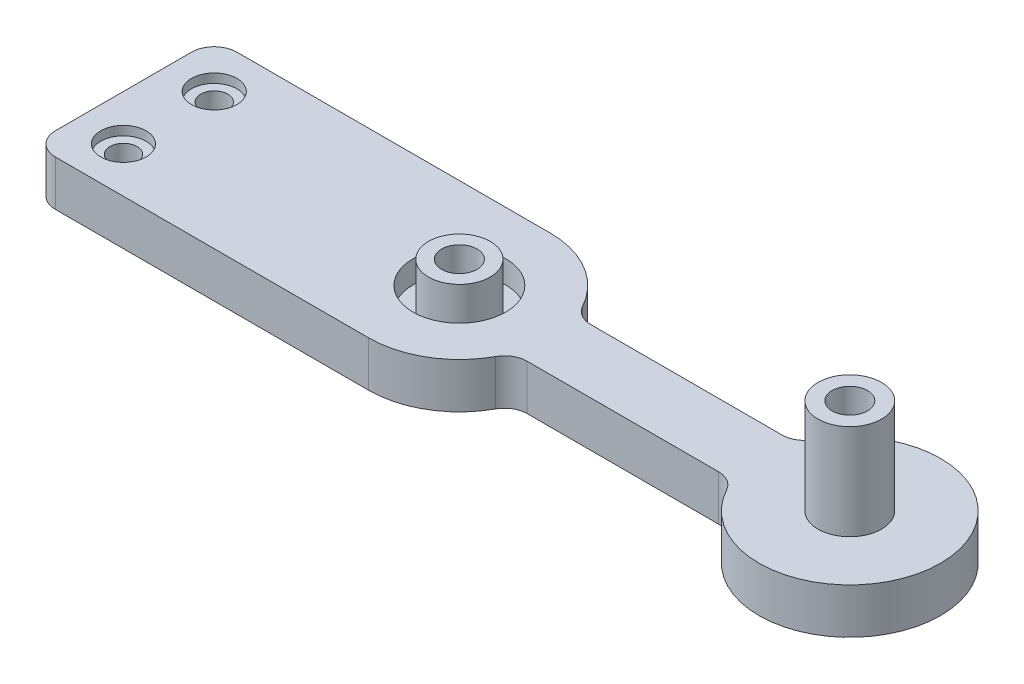
ISO-10303-21;
HEADER;
FILE_DESCRIPTION(('STEP AP214'),'2;1');
FILE_NAME('part.step','',(''),(''),'','','');
FILE_SCHEMA(('AUTOMOTIVE_DESIGN { 1 0 10303 214 1 1 1 1 }'));
ENDSEC;
DATA;
#1=APPLICATION_CONTEXT('core data for automotive mechanical design processes');
#2=APPLICATION_PROTOCOL_DEFINITION('international standard','automotive_design',2000,#1);
#3=PRODUCT_CONTEXT('',#1,'mechanical');
#4=PRODUCT('Part','Part','',(#3));
#5=PRODUCT_RELATED_PRODUCT_CATEGORY('part','',(#4));
#6=PRODUCT_DEFINITION_FORMATION('','',#4);
#7=PRODUCT_DEFINITION_CONTEXT('part definition',#1,'design');
#8=PRODUCT_DEFINITION('design','',#6,#7);
#9=PRODUCT_DEFINITION_SHAPE('','',#8);
#10=(LENGTH_UNIT() NAMED_UNIT(*) SI_UNIT(.MILLI.,.METRE.));
#11=(NAMED_UNIT(*) PLANE_ANGLE_UNIT() SI_UNIT($,.RADIAN.));
#12=(NAMED_UNIT(*) SI_UNIT($,.STERADIAN.) SOLID_ANGLE_UNIT());
#13=UNCERTAINTY_MEASURE_WITH_UNIT(LENGTH_MEASURE(1.E-05),#10,'distance_accuracy_value','');
#14=(GEOMETRIC_REPRESENTATION_CONTEXT(3) GLOBAL_UNCERTAINTY_ASSIGNED_CONTEXT((#13)) GLOBAL_UNIT_ASSIGNED_CONTEXT((#10,
#11,#12)) REPRESENTATION_CONTEXT('',''));
#15=CARTESIAN_POINT('',(0.,0.,0.));
#16=DIRECTION('',(0.,0.,1.));
#17=DIRECTION('',(1.,0.,0.));
#18=AXIS2_PLACEMENT_3D('',#15,#16,#17);
#19=CARTESIAN_POINT('',(-43.815,6.35,9.52500000000001));
#20=DIRECTION('',(0.,1.,0.));
#21=DIRECTION('',(0.,0.,1.));
#22=AXIS2_PLACEMENT_3D('',#19,#20,#21);
#23=PLANE('',#22);
#24=CARTESIAN_POINT('',(-40.64,6.35,-6.35));
#25=DIRECTION('',(0.,1.,0.));
#26=DIRECTION('',(0.,0.,1.));
#27=AXIS2_PLACEMENT_3D('',#24,#25,#26);
#28=CIRCLE('',#27,3.175);
#29=CARTESIAN_POINT('',(-40.64,6.35,-3.175));
#30=VERTEX_POINT('',#29);
#31=EDGE_CURVE('E346',#30,#30,#28,.T.);
#32=ORIENTED_EDGE('',*,*,#31,.F.);
#33=EDGE_LOOP('',(#32));
#34=FACE_BOUND('',#33,.T.);
#35=CARTESIAN_POINT('',(-40.64,6.35,6.35));
#36=DIRECTION('',(0.,1.,0.));
#37=DIRECTION('',(0.,0.,1.));
#38=AXIS2_PLACEMENT_3D('',#35,#36,#37);
#39=CIRCLE('',#38,3.175);
#40=CARTESIAN_POINT('',(-40.64,6.35,9.525));
#41=VERTEX_POINT('',#40);
#42=EDGE_CURVE('E349',#41,#41,#39,.T.);
#43=ORIENTED_EDGE('',*,*,#42,.F.);
#44=EDGE_LOOP('',(#43));
#45=FACE_BOUND('',#44,.T.);
#46=CARTESIAN_POINT('',(-43.815,6.35,9.52500000000001));
#47=DIRECTION('',(0.,1.,0.));
#48=DIRECTION('',(0.,0.,1.));
#49=AXIS2_PLACEMENT_3D('',#46,#47,#48);
#50=CIRCLE('',#49,3.175);
#51=CARTESIAN_POINT('',(-46.99,6.35,9.52499999999999));
#52=VERTEX_POINT('',#51);
#53=CARTESIAN_POINT('',(-43.815,6.35,12.7));
#54=VERTEX_POINT('',#53);
#55=EDGE_CURVE('E207',#52,#54,#50,.T.);
#56=ORIENTED_EDGE('',*,*,#55,.T.);
#57=DIRECTION('',(1.,0.,0.));
#58=VECTOR('',#57,1.);
#59=CARTESIAN_POINT('',(-43.815,6.35,12.7));
#60=LINE('',#59,#58);
#61=CARTESIAN_POINT('',(0.,6.35,12.7));
#62=VERTEX_POINT('',#61);
#63=EDGE_CURVE('E125',#54,#62,#60,.T.);
#64=ORIENTED_EDGE('',*,*,#63,.T.);
#65=CARTESIAN_POINT('',(0.,6.35,0.));
#66=DIRECTION('',(0.,1.,0.));
#67=DIRECTION('',(0.,0.,1.));
#68=AXIS2_PLACEMENT_3D('',#65,#66,#67);
#69=CIRCLE('',#68,12.7);
#70=CARTESIAN_POINT('',(11.1413097973263,6.35,6.096));
#71=VERTEX_POINT('',#70);
#72=EDGE_CURVE('E240',#62,#71,#69,.T.);
#73=ORIENTED_EDGE('',*,*,#72,.T.);
#74=CARTESIAN_POINT('',(13.9266372466579,6.35,7.62));
#75=DIRECTION('',(0.,-1.,0.));
#76=DIRECTION('',(0.,0.,1.));
#77=AXIS2_PLACEMENT_3D('',#74,#75,#76);
#78=CIRCLE('',#77,3.175);
#79=CARTESIAN_POINT('',(13.9266372466579,6.35,4.445));
#80=VERTEX_POINT('',#79);
#81=EDGE_CURVE('E259',#71,#80,#78,.T.);
#82=ORIENTED_EDGE('',*,*,#81,.T.);
#83=DIRECTION('',(1.,0.,0.));
#84=VECTOR('',#83,1.);
#85=CARTESIAN_POINT('',(13.9266372466579,6.35,4.445));
#86=LINE('',#85,#84);
#87=CARTESIAN_POINT('',(40.6833627533421,6.35,4.445));
#88=VERTEX_POINT('',#87);
#89=EDGE_CURVE('E256',#80,#88,#86,.T.);
#90=ORIENTED_EDGE('',*,*,#89,.T.);
#91=CARTESIAN_POINT('',(40.6833627533421,6.35,7.62));
#92=DIRECTION('',(0.,-1.,0.));
#93=DIRECTION('',(0.,0.,-1.));
#94=AXIS2_PLACEMENT_3D('',#91,#92,#93);
#95=CIRCLE('',#94,3.175);
#96=CARTESIAN_POINT('',(43.4686902026736,6.35,6.09599999999999));
#97=VERTEX_POINT('',#96);
#98=EDGE_CURVE('E258',#88,#97,#95,.T.);
#99=ORIENTED_EDGE('',*,*,#98,.T.);
#100=CARTESIAN_POINT('',(54.61,6.35,0.));
#101=DIRECTION('',(0.,1.,0.));
#102=DIRECTION('',(0.,0.,1.));
#103=AXIS2_PLACEMENT_3D('',#100,#101,#102);
#104=CIRCLE('',#103,12.7);
#105=CARTESIAN_POINT('',(43.4686902026737,6.35,-6.096));
#106=VERTEX_POINT('',#105);
#107=EDGE_CURVE('E261',#97,#106,#104,.T.);
#108=ORIENTED_EDGE('',*,*,#107,.T.);
#109=CARTESIAN_POINT('',(40.6833627533421,6.35,-7.62));
#110=DIRECTION('',(0.,-1.,0.));
#111=DIRECTION('',(0.,0.,1.));
#112=AXIS2_PLACEMENT_3D('',#109,#110,#111);
#113=CIRCLE('',#112,3.175);
#114=CARTESIAN_POINT('',(40.6833627533421,6.35,-4.445));
#115=VERTEX_POINT('',#114);
#116=EDGE_CURVE('E267',#106,#115,#113,.T.);
#117=ORIENTED_EDGE('',*,*,#116,.T.);
#118=DIRECTION('',(-1.,0.,0.));
#119=VECTOR('',#118,1.);
#120=CARTESIAN_POINT('',(13.9266372466579,6.35,-4.445));
#121=LINE('',#120,#119);
#122=CARTESIAN_POINT('',(13.9266372466579,6.35,-4.445));
#123=VERTEX_POINT('',#122);
#124=EDGE_CURVE('E269',#115,#123,#121,.T.);
#125=ORIENTED_EDGE('',*,*,#124,.T.);
#126=CARTESIAN_POINT('',(13.9266372466579,6.35,-7.62));
#127=DIRECTION('',(0.,-1.,0.));
#128=DIRECTION('',(0.,0.,-1.));
#129=AXIS2_PLACEMENT_3D('',#126,#127,#128);
#130=CIRCLE('',#129,3.175);
#131=CARTESIAN_POINT('',(11.1413097973263,6.35,-6.096));
#132=VERTEX_POINT('',#131);
#133=EDGE_CURVE('E271',#123,#132,#130,.T.);
#134=ORIENTED_EDGE('',*,*,#133,.T.);
#135=CARTESIAN_POINT('',(0.,6.35,0.));
#136=DIRECTION('',(0.,1.,0.));
#137=DIRECTION('',(0.,0.,1.));
#138=AXIS2_PLACEMENT_3D('',#135,#136,#137);
#139=CIRCLE('',#138,12.7);
#140=CARTESIAN_POINT('',(0.,6.35,-12.7));
#141=VERTEX_POINT('',#140);
#142=EDGE_CURVE('E162',#132,#141,#139,.T.);
#143=ORIENTED_EDGE('',*,*,#142,.T.);
#144=DIRECTION('',(-1.,0.,0.));
#145=VECTOR('',#144,1.);
#146=CARTESIAN_POINT('',(0.,6.35,-12.7));
#147=LINE('',#146,#145);
#148=CARTESIAN_POINT('',(-43.815,6.35,-12.7));
#149=VERTEX_POINT('',#148);
#150=EDGE_CURVE('E156',#141,#149,#147,.T.);
#151=ORIENTED_EDGE('',*,*,#150,.T.);
#152=CARTESIAN_POINT('',(-43.815,6.35,-9.525));
#153=DIRECTION('',(0.,1.,0.));
#154=DIRECTION('',(0.,0.,1.));
#155=AXIS2_PLACEMENT_3D('',#152,#153,#154);
#156=CIRCLE('',#155,3.175);
#157=CARTESIAN_POINT('',(-46.99,6.35,-9.52499999999997));
#158=VERTEX_POINT('',#157);
#159=EDGE_CURVE('E160',#149,#158,#156,.T.);
#160=ORIENTED_EDGE('',*,*,#159,.T.);
#161=DIRECTION('',(0.,0.,1.));
#162=VECTOR('',#161,1.);
#163=CARTESIAN_POINT('',(-46.99,6.35,-9.52499999999997));
#164=LINE('',#163,#162);
#165=EDGE_CURVE('E64',#158,#52,#164,.T.);
#166=ORIENTED_EDGE('',*,*,#165,.T.);
#167=EDGE_LOOP('',(#56,#64,#73,#82,#90,#99,#108,#117,#125,#134,#143,#151,#160,#166));
#168=FACE_BOUND('',#167,.T.);
#169=CARTESIAN_POINT('',(0.,6.35,0.));
#170=DIRECTION('',(0.,1.,0.));
#171=DIRECTION('',(0.,0.,1.));
#172=AXIS2_PLACEMENT_3D('',#169,#170,#171);
#173=CIRCLE('',#172,6.477);
#174=CARTESIAN_POINT('',(0.,6.35,6.477));
#175=VERTEX_POINT('',#174);
#176=EDGE_CURVE('E369',#175,#175,#173,.T.);
#177=ORIENTED_EDGE('',*,*,#176,.F.);
#178=EDGE_LOOP('',(#177));
#179=FACE_BOUND('',#178,.T.);
#180=CARTESIAN_POINT('',(54.61,6.35,0.));
#181=DIRECTION('',(0.,1.,0.));
#182=DIRECTION('',(0.,0.,1.));
#183=AXIS2_PLACEMENT_3D('',#180,#181,#182);
#184=CIRCLE('',#183,4.445);
#185=CARTESIAN_POINT('',(54.61,6.35,4.445));
#186=VERTEX_POINT('',#185);
#187=EDGE_CURVE('E356',#186,#186,#184,.T.);
#188=ORIENTED_EDGE('',*,*,#187,.F.);
#189=EDGE_LOOP('',(#188));
#190=FACE_BOUND('',#189,.T.);
#191=ADVANCED_FACE('F47',(#34,#45,#168,#179,#190),#23,.T.);
#192=CARTESIAN_POINT('',(0.,3.175,0.));
#193=DIRECTION('',(0.,1.,0.));
#194=DIRECTION('',(0.,0.,1.));
#195=AXIS2_PLACEMENT_3D('',#192,#193,#194);
#196=PLANE('',#195);
#197=CARTESIAN_POINT('',(0.,3.175,0.));
#198=DIRECTION('',(0.,1.,0.));
#199=DIRECTION('',(0.,0.,1.));
#200=AXIS2_PLACEMENT_3D('',#197,#198,#199);
#201=CIRCLE('',#200,6.477);
#202=CARTESIAN_POINT('',(0.,3.175,6.477));
#203=VERTEX_POINT('',#202);
#204=EDGE_CURVE('E372',#203,#203,#201,.T.);
#205=ORIENTED_EDGE('',*,*,#204,.T.);
#206=EDGE_LOOP('',(#205));
#207=FACE_BOUND('',#206,.T.);
#208=CARTESIAN_POINT('',(0.,3.175,0.));
#209=DIRECTION('',(0.,1.,0.));
#210=DIRECTION('',(0.,0.,1.));
#211=AXIS2_PLACEMENT_3D('',#208,#209,#210);
#212=CIRCLE('',#211,4.318);
#213=CARTESIAN_POINT('',(0.,3.175,4.318));
#214=VERTEX_POINT('',#213);
#215=EDGE_CURVE('E365',#214,#214,#212,.T.);
#216=ORIENTED_EDGE('',*,*,#215,.F.);
#217=EDGE_LOOP('',(#216));
#218=FACE_BOUND('',#217,.T.);
#219=ADVANCED_FACE('F300',(#207,#218),#196,.T.);
#220=CARTESIAN_POINT('',(0.,6.35,0.));
#221=DIRECTION('',(0.,-1.,0.));
#222=DIRECTION('',(0.,0.,-1.));
#223=AXIS2_PLACEMENT_3D('',#220,#221,#222);
#224=CYLINDRICAL_SURFACE('',#223,2.4765);
#225=CARTESIAN_POINT('',(0.,0.,0.));
#226=DIRECTION('',(0.,1.,0.));
#227=DIRECTION('',(0.,0.,1.));
#228=AXIS2_PLACEMENT_3D('',#225,#226,#227);
#229=CIRCLE('',#228,2.4765);
#230=CARTESIAN_POINT('',(0.,0.,2.4765));
#231=VERTEX_POINT('',#230);
#232=EDGE_CURVE('E184',#231,#231,#229,.T.);
#233=ORIENTED_EDGE('',*,*,#232,.F.);
#234=EDGE_LOOP('',(#233));
#235=FACE_BOUND('',#234,.T.);
#236=CARTESIAN_POINT('',(0.,9.525,0.));
#237=DIRECTION('',(0.,1.,0.));
#238=DIRECTION('',(0.,0.,1.));
#239=AXIS2_PLACEMENT_3D('',#236,#237,#238);
#240=CIRCLE('',#239,2.4765);
#241=CARTESIAN_POINT('',(0.,9.525,2.4765));
#242=VERTEX_POINT('',#241);
#243=EDGE_CURVE('E360',#242,#242,#240,.T.);
#244=ORIENTED_EDGE('',*,*,#243,.T.);
#245=EDGE_LOOP('',(#244));
#246=FACE_BOUND('',#245,.T.);
#247=ADVANCED_FACE('F308',(#235,#246),#224,.F.);
#248=CARTESIAN_POINT('',(-43.815,0.,9.52500000000001));
#249=DIRECTION('',(0.,1.,0.));
#250=DIRECTION('',(0.,0.,1.));
#251=AXIS2_PLACEMENT_3D('',#248,#249,#250);
#252=PLANE('',#251);
#253=CARTESIAN_POINT('',(-40.64,0.,-6.35));
#254=DIRECTION('',(0.,1.,0.));
#255=DIRECTION('',(0.,0.,1.));
#256=AXIS2_PLACEMENT_3D('',#253,#254,#255);
#257=CIRCLE('',#256,1.89864999999999);
#258=CARTESIAN_POINT('',(-40.64,0.,-4.45135000000001));
#259=VERTEX_POINT('',#258);
#260=EDGE_CURVE('E327',#259,#259,#257,.T.);
#261=ORIENTED_EDGE('',*,*,#260,.T.);
#262=EDGE_LOOP('',(#261));
#263=FACE_BOUND('',#262,.T.);
#264=CARTESIAN_POINT('',(-40.64,0.,6.35));
#265=DIRECTION('',(0.,1.,0.));
#266=DIRECTION('',(0.,0.,1.));
#267=AXIS2_PLACEMENT_3D('',#264,#265,#266);
#268=CIRCLE('',#267,1.89864999999999);
#269=CARTESIAN_POINT('',(-40.64,0.,8.24864999999999));
#270=VERTEX_POINT('',#269);
#271=EDGE_CURVE('E330',#270,#270,#268,.T.);
#272=ORIENTED_EDGE('',*,*,#271,.T.);
#273=EDGE_LOOP('',(#272));
#274=FACE_BOUND('',#273,.T.);
#275=CARTESIAN_POINT('',(-43.815,0.,9.52500000000001));
#276=DIRECTION('',(0.,1.,0.));
#277=DIRECTION('',(0.,0.,1.));
#278=AXIS2_PLACEMENT_3D('',#275,#276,#277);
#279=CIRCLE('',#278,3.175);
#280=CARTESIAN_POINT('',(-46.99,0.,9.52499999999999));
#281=VERTEX_POINT('',#280);
#282=CARTESIAN_POINT('',(-43.815,0.,12.7));
#283=VERTEX_POINT('',#282);
#284=EDGE_CURVE('E180',#281,#283,#279,.T.);
#285=ORIENTED_EDGE('',*,*,#284,.F.);
#286=DIRECTION('',(0.,0.,1.));
#287=VECTOR('',#286,1.);
#288=CARTESIAN_POINT('',(-46.99,0.,-9.52499999999997));
#289=LINE('',#288,#287);
#290=CARTESIAN_POINT('',(-46.99,0.,-9.52499999999997));
#291=VERTEX_POINT('',#290);
#292=EDGE_CURVE('E117',#291,#281,#289,.T.);
#293=ORIENTED_EDGE('',*,*,#292,.F.);
#294=CARTESIAN_POINT('',(-43.815,0.,-9.525));
#295=DIRECTION('',(0.,1.,0.));
#296=DIRECTION('',(0.,0.,1.));
#297=AXIS2_PLACEMENT_3D('',#294,#295,#296);
#298=CIRCLE('',#297,3.175);
#299=CARTESIAN_POINT('',(-43.815,0.,-12.7));
#300=VERTEX_POINT('',#299);
#301=EDGE_CURVE('E111',#300,#291,#298,.T.);
#302=ORIENTED_EDGE('',*,*,#301,.F.);
#303=DIRECTION('',(-1.,0.,0.));
#304=VECTOR('',#303,1.);
#305=CARTESIAN_POINT('',(0.,0.,-12.7));
#306=LINE('',#305,#304);
#307=CARTESIAN_POINT('',(0.,0.,-12.7));
#308=VERTEX_POINT('',#307);
#309=EDGE_CURVE('E170',#308,#300,#306,.T.);
#310=ORIENTED_EDGE('',*,*,#309,.F.);
#311=CARTESIAN_POINT('',(0.,0.,0.));
#312=DIRECTION('',(0.,1.,0.));
#313=DIRECTION('',(0.,0.,1.));
#314=AXIS2_PLACEMENT_3D('',#311,#312,#313);
#315=CIRCLE('',#314,12.7);
#316=CARTESIAN_POINT('',(11.1413097973263,0.,-6.096));
#317=VERTEX_POINT('',#316);
#318=EDGE_CURVE('E202',#317,#308,#315,.T.);
#319=ORIENTED_EDGE('',*,*,#318,.F.);
#320=CARTESIAN_POINT('',(13.9266372466579,0.,-7.62));
#321=DIRECTION('',(0.,-1.,0.));
#322=DIRECTION('',(0.,0.,-1.));
#323=AXIS2_PLACEMENT_3D('',#320,#321,#322);
#324=CIRCLE('',#323,3.175);
#325=CARTESIAN_POINT('',(13.9266372466579,0.,-4.445));
#326=VERTEX_POINT('',#325);
#327=EDGE_CURVE('E200',#326,#317,#324,.T.);
#328=ORIENTED_EDGE('',*,*,#327,.F.);
#329=DIRECTION('',(-1.,0.,0.));
#330=VECTOR('',#329,1.);
#331=CARTESIAN_POINT('',(13.9266372466579,0.,-4.445));
#332=LINE('',#331,#330);
#333=CARTESIAN_POINT('',(40.6833627533421,0.,-4.445));
#334=VERTEX_POINT('',#333);
#335=EDGE_CURVE('E198',#334,#326,#332,.T.);
#336=ORIENTED_EDGE('',*,*,#335,.F.);
#337=CARTESIAN_POINT('',(40.6833627533421,0.,-7.62));
#338=DIRECTION('',(0.,-1.,0.));
#339=DIRECTION('',(0.,0.,1.));
#340=AXIS2_PLACEMENT_3D('',#337,#338,#339);
#341=CIRCLE('',#340,3.175);
#342=CARTESIAN_POINT('',(43.4686902026737,0.,-6.096));
#343=VERTEX_POINT('',#342);
#344=EDGE_CURVE('E196',#343,#334,#341,.T.);
#345=ORIENTED_EDGE('',*,*,#344,.F.);
#346=CARTESIAN_POINT('',(54.61,0.,0.));
#347=DIRECTION('',(0.,1.,0.));
#348=DIRECTION('',(0.,0.,1.));
#349=AXIS2_PLACEMENT_3D('',#346,#347,#348);
#350=CIRCLE('',#349,12.7);
#351=CARTESIAN_POINT('',(43.4686902026736,0.,6.09599999999999));
#352=VERTEX_POINT('',#351);
#353=EDGE_CURVE('E194',#352,#343,#350,.T.);
#354=ORIENTED_EDGE('',*,*,#353,.F.);
#355=CARTESIAN_POINT('',(40.6833627533421,0.,7.62));
#356=DIRECTION('',(0.,-1.,0.));
#357=DIRECTION('',(0.,0.,-1.));
#358=AXIS2_PLACEMENT_3D('',#355,#356,#357);
#359=CIRCLE('',#358,3.175);
#360=CARTESIAN_POINT('',(40.6833627533421,0.,4.445));
#361=VERTEX_POINT('',#360);
#362=EDGE_CURVE('E192',#361,#352,#359,.T.);
#363=ORIENTED_EDGE('',*,*,#362,.F.);
#364=DIRECTION('',(1.,0.,0.));
#365=VECTOR('',#364,1.);
#366=CARTESIAN_POINT('',(13.9266372466579,0.,4.445));
#367=LINE('',#366,#365);
#368=CARTESIAN_POINT('',(13.9266372466579,0.,4.445));
#369=VERTEX_POINT('',#368);
#370=EDGE_CURVE('E190',#369,#361,#367,.T.);
#371=ORIENTED_EDGE('',*,*,#370,.F.);
#372=CARTESIAN_POINT('',(13.9266372466579,0.,7.62));
#373=DIRECTION('',(0.,-1.,0.));
#374=DIRECTION('',(0.,0.,1.));
#375=AXIS2_PLACEMENT_3D('',#372,#373,#374);
#376=CIRCLE('',#375,3.175);
#377=CARTESIAN_POINT('',(11.1413097973263,0.,6.096));
#378=VERTEX_POINT('',#377);
#379=EDGE_CURVE('E188',#378,#369,#376,.T.);
#380=ORIENTED_EDGE('',*,*,#379,.F.);
#381=CARTESIAN_POINT('',(0.,0.,0.));
#382=DIRECTION('',(0.,1.,0.));
#383=DIRECTION('',(0.,0.,1.));
#384=AXIS2_PLACEMENT_3D('',#381,#382,#383);
#385=CIRCLE('',#384,12.7);
#386=CARTESIAN_POINT('',(0.,0.,12.7));
#387=VERTEX_POINT('',#386);
#388=EDGE_CURVE('E186',#387,#378,#385,.T.);
#389=ORIENTED_EDGE('',*,*,#388,.F.);
#390=DIRECTION('',(1.,0.,0.));
#391=VECTOR('',#390,1.);
#392=CARTESIAN_POINT('',(-43.815,0.,12.7));
#393=LINE('',#392,#391);
#394=EDGE_CURVE('E183',#283,#387,#393,.T.);
#395=ORIENTED_EDGE('',*,*,#394,.F.);
#396=EDGE_LOOP('',(#285,#293,#302,#310,#319,#328,#336,#345,#354,#363,#371,#380,#389,#395));
#397=FACE_BOUND('',#396,.T.);
#398=ORIENTED_EDGE('',*,*,#232,.T.);
#399=EDGE_LOOP('',(#398));
#400=FACE_BOUND('',#399,.T.);
#401=CARTESIAN_POINT('',(54.61,0.,0.));
#402=DIRECTION('',(0.,1.,0.));
#403=DIRECTION('',(0.,0.,1.));
#404=AXIS2_PLACEMENT_3D('',#401,#402,#403);
#405=CIRCLE('',#404,2.4765);
#406=CARTESIAN_POINT('',(54.61,0.,2.4765));
#407=VERTEX_POINT('',#406);
#408=EDGE_CURVE('E375',#407,#407,#405,.T.);
#409=ORIENTED_EDGE('',*,*,#408,.T.);
#410=EDGE_LOOP('',(#409));
#411=FACE_BOUND('',#410,.T.);
#412=ADVANCED_FACE('F244',(#263,#274,#397,#400,#411),#252,.F.);
#413=CARTESIAN_POINT('',(-43.815,6.35,9.52500000000001));
#414=DIRECTION('',(0.,-1.,0.));
#415=DIRECTION('',(0.,0.,-1.));
#416=AXIS2_PLACEMENT_3D('',#413,#414,#415);
#417=CYLINDRICAL_SURFACE('',#416,3.175);
#418=ORIENTED_EDGE('',*,*,#284,.T.);
#419=DIRECTION('',(0.,-1.,0.));
#420=VECTOR('',#419,1.);
#421=CARTESIAN_POINT('',(-43.815,6.35,12.7));
#422=LINE('',#421,#420);
#423=EDGE_CURVE('E11',#54,#283,#422,.T.);
#424=ORIENTED_EDGE('',*,*,#423,.F.);
#425=ORIENTED_EDGE('',*,*,#55,.F.);
#426=DIRECTION('',(0.,-1.,0.));
#427=VECTOR('',#426,1.);
#428=CARTESIAN_POINT('',(-46.99,6.35,9.52499999999999));
#429=LINE('',#428,#427);
#430=EDGE_CURVE('E176',#52,#281,#429,.T.);
#431=ORIENTED_EDGE('',*,*,#430,.T.);
#432=EDGE_LOOP('',(#418,#424,#425,#431));
#433=FACE_BOUND('',#432,.T.);
#434=ADVANCED_FACE('F49',(#433),#417,.T.);
#435=CARTESIAN_POINT('',(-43.815,6.35,12.7));
#436=DIRECTION('',(0.,0.,-1.));
#437=DIRECTION('',(-1.,0.,0.));
#438=AXIS2_PLACEMENT_3D('',#435,#436,#437);
#439=PLANE('',#438);
#440=ORIENTED_EDGE('',*,*,#394,.T.);
#441=DIRECTION('',(0.,-1.,0.));
#442=VECTOR('',#441,1.);
#443=CARTESIAN_POINT('',(0.,6.35,12.7));
#444=LINE('',#443,#442);
#445=EDGE_CURVE('E56',#62,#387,#444,.T.);
#446=ORIENTED_EDGE('',*,*,#445,.F.);
#447=ORIENTED_EDGE('',*,*,#63,.F.);
#448=ORIENTED_EDGE('',*,*,#423,.T.);
#449=EDGE_LOOP('',(#440,#446,#447,#448));
#450=FACE_BOUND('',#449,.T.);
#451=ADVANCED_FACE('F321',(#450),#439,.F.);
#452=CARTESIAN_POINT('',(0.,6.35,0.));
#453=DIRECTION('',(0.,-1.,0.));
#454=DIRECTION('',(0.,0.,-1.));
#455=AXIS2_PLACEMENT_3D('',#452,#453,#454);
#456=CYLINDRICAL_SURFACE('',#455,12.7);
#457=ORIENTED_EDGE('',*,*,#388,.T.);
#458=DIRECTION('',(0.,-1.,0.));
#459=VECTOR('',#458,1.);
#460=CARTESIAN_POINT('',(11.1413097973263,6.35,6.096));
#461=LINE('',#460,#459);
#462=EDGE_CURVE('E232',#71,#378,#461,.T.);
#463=ORIENTED_EDGE('',*,*,#462,.F.);
#464=ORIENTED_EDGE('',*,*,#72,.F.);
#465=ORIENTED_EDGE('',*,*,#445,.T.);
#466=EDGE_LOOP('',(#457,#463,#464,#465));
#467=FACE_BOUND('',#466,.T.);
#468=ADVANCED_FACE('F238',(#467),#456,.T.);
#469=CARTESIAN_POINT('',(13.9266372466579,6.35,7.62));
#470=DIRECTION('',(0.,-1.,0.));
#471=DIRECTION('',(0.,0.,-1.));
#472=AXIS2_PLACEMENT_3D('',#469,#470,#471);
#473=CYLINDRICAL_SURFACE('',#472,3.175);
#474=ORIENTED_EDGE('',*,*,#379,.T.);
#475=DIRECTION('',(0.,-1.,0.));
#476=VECTOR('',#475,1.);
#477=CARTESIAN_POINT('',(13.9266372466579,6.35,4.445));
#478=LINE('',#477,#476);
#479=EDGE_CURVE('E229',#80,#369,#478,.T.);
#480=ORIENTED_EDGE('',*,*,#479,.F.);
#481=ORIENTED_EDGE('',*,*,#81,.F.);
#482=ORIENTED_EDGE('',*,*,#462,.T.);
#483=EDGE_LOOP('',(#474,#480,#481,#482));
#484=FACE_BOUND('',#483,.T.);
#485=ADVANCED_FACE('F250',(#484),#473,.F.);
#486=CARTESIAN_POINT('',(13.9266372466579,6.35,4.445));
#487=DIRECTION('',(0.,0.,-1.));
#488=DIRECTION('',(-1.,0.,0.));
#489=AXIS2_PLACEMENT_3D('',#486,#487,#488);
#490=PLANE('',#489);
#491=ORIENTED_EDGE('',*,*,#370,.T.);
#492=DIRECTION('',(0.,-1.,0.));
#493=VECTOR('',#492,1.);
#494=CARTESIAN_POINT('',(40.6833627533421,6.35,4.445));
#495=LINE('',#494,#493);
#496=EDGE_CURVE('E226',#88,#361,#495,.T.);
#497=ORIENTED_EDGE('',*,*,#496,.F.);
#498=ORIENTED_EDGE('',*,*,#89,.F.);
#499=ORIENTED_EDGE('',*,*,#479,.T.);
#500=EDGE_LOOP('',(#491,#497,#498,#499));
#501=FACE_BOUND('',#500,.T.);
#502=ADVANCED_FACE('F254',(#501),#490,.F.);
#503=CARTESIAN_POINT('',(40.6833627533421,6.35,7.62));
#504=DIRECTION('',(0.,-1.,0.));
#505=DIRECTION('',(0.,0.,-1.));
#506=AXIS2_PLACEMENT_3D('',#503,#504,#505);
#507=CYLINDRICAL_SURFACE('',#506,3.175);
#508=ORIENTED_EDGE('',*,*,#362,.T.);
#509=DIRECTION('',(0.,-1.,0.));
#510=VECTOR('',#509,1.);
#511=CARTESIAN_POINT('',(43.4686902026736,6.35,6.09599999999999));
#512=LINE('',#511,#510);
#513=EDGE_CURVE('E223',#97,#352,#512,.T.);
#514=ORIENTED_EDGE('',*,*,#513,.F.);
#515=ORIENTED_EDGE('',*,*,#98,.F.);
#516=ORIENTED_EDGE('',*,*,#496,.T.);
#517=EDGE_LOOP('',(#508,#514,#515,#516));
#518=FACE_BOUND('',#517,.T.);
#519=ADVANCED_FACE('F590',(#518),#507,.F.);
#520=CARTESIAN_POINT('',(54.61,6.35,0.));
#521=DIRECTION('',(0.,-1.,0.));
#522=DIRECTION('',(0.,0.,-1.));
#523=AXIS2_PLACEMENT_3D('',#520,#521,#522);
#524=CYLINDRICAL_SURFACE('',#523,12.7);
#525=ORIENTED_EDGE('',*,*,#353,.T.);
#526=DIRECTION('',(0.,-1.,0.));
#527=VECTOR('',#526,1.);
#528=CARTESIAN_POINT('',(43.4686902026737,6.35,-6.096));
#529=LINE('',#528,#527);
#530=EDGE_CURVE('E220',#106,#343,#529,.T.);
#531=ORIENTED_EDGE('',*,*,#530,.F.);
#532=ORIENTED_EDGE('',*,*,#107,.F.);
#533=ORIENTED_EDGE('',*,*,#513,.T.);
#534=EDGE_LOOP('',(#525,#531,#532,#533));
#535=FACE_BOUND('',#534,.T.);
#536=ADVANCED_FACE('F581',(#535),#524,.T.);
#537=CARTESIAN_POINT('',(40.6833627533421,6.35,-7.62));
#538=DIRECTION('',(0.,-1.,0.));
#539=DIRECTION('',(0.,0.,-1.));
#540=AXIS2_PLACEMENT_3D('',#537,#538,#539);
#541=CYLINDRICAL_SURFACE('',#540,3.175);
#542=ORIENTED_EDGE('',*,*,#344,.T.);
#543=DIRECTION('',(0.,-1.,0.));
#544=VECTOR('',#543,1.);
#545=CARTESIAN_POINT('',(40.6833627533421,6.35,-4.445));
#546=LINE('',#545,#544);
#547=EDGE_CURVE('E217',#115,#334,#546,.T.);
#548=ORIENTED_EDGE('',*,*,#547,.F.);
#549=ORIENTED_EDGE('',*,*,#116,.F.);
#550=ORIENTED_EDGE('',*,*,#530,.T.);
#551=EDGE_LOOP('',(#542,#548,#549,#550));
#552=FACE_BOUND('',#551,.T.);
#553=ADVANCED_FACE('F572',(#552),#541,.F.);
#554=CARTESIAN_POINT('',(13.9266372466579,6.35,-4.445));
#555=DIRECTION('',(0.,0.,1.));
#556=DIRECTION('',(1.,0.,0.));
#557=AXIS2_PLACEMENT_3D('',#554,#555,#556);
#558=PLANE('',#557);
#559=ORIENTED_EDGE('',*,*,#335,.T.);
#560=DIRECTION('',(0.,-1.,0.));
#561=VECTOR('',#560,1.);
#562=CARTESIAN_POINT('',(13.9266372466579,6.35,-4.445));
#563=LINE('',#562,#561);
#564=EDGE_CURVE('E214',#123,#326,#563,.T.);
#565=ORIENTED_EDGE('',*,*,#564,.F.);
#566=ORIENTED_EDGE('',*,*,#124,.F.);
#567=ORIENTED_EDGE('',*,*,#547,.T.);
#568=EDGE_LOOP('',(#559,#565,#566,#567));
#569=FACE_BOUND('',#568,.T.);
#570=ADVANCED_FACE('F564',(#569),#558,.F.);
#571=CARTESIAN_POINT('',(13.9266372466579,6.35,-7.62));
#572=DIRECTION('',(0.,-1.,0.));
#573=DIRECTION('',(0.,0.,-1.));
#574=AXIS2_PLACEMENT_3D('',#571,#572,#573);
#575=CYLINDRICAL_SURFACE('',#574,3.175);
#576=ORIENTED_EDGE('',*,*,#327,.T.);
#577=DIRECTION('',(0.,-1.,0.));
#578=VECTOR('',#577,1.);
#579=CARTESIAN_POINT('',(11.1413097973263,6.35,-6.096));
#580=LINE('',#579,#578);
#581=EDGE_CURVE('E211',#132,#317,#580,.T.);
#582=ORIENTED_EDGE('',*,*,#581,.F.);
#583=ORIENTED_EDGE('',*,*,#133,.F.);
#584=ORIENTED_EDGE('',*,*,#564,.T.);
#585=EDGE_LOOP('',(#576,#582,#583,#584));
#586=FACE_BOUND('',#585,.T.);
#587=ADVANCED_FACE('F277',(#586),#575,.F.);
#588=CARTESIAN_POINT('',(0.,6.35,0.));
#589=DIRECTION('',(0.,-1.,0.));
#590=DIRECTION('',(0.,0.,-1.));
#591=AXIS2_PLACEMENT_3D('',#588,#589,#590);
#592=CYLINDRICAL_SURFACE('',#591,12.7);
#593=ORIENTED_EDGE('',*,*,#318,.T.);
#594=DIRECTION('',(0.,-1.,0.));
#595=VECTOR('',#594,1.);
#596=CARTESIAN_POINT('',(0.,6.35,-12.7));
#597=LINE('',#596,#595);
#598=EDGE_CURVE('E171',#141,#308,#597,.T.);
#599=ORIENTED_EDGE('',*,*,#598,.F.);
#600=ORIENTED_EDGE('',*,*,#142,.F.);
#601=ORIENTED_EDGE('',*,*,#581,.T.);
#602=EDGE_LOOP('',(#593,#599,#600,#601));
#603=FACE_BOUND('',#602,.T.);
#604=ADVANCED_FACE('F281',(#603),#592,.T.);
#605=CARTESIAN_POINT('',(0.,6.35,-12.7));
#606=DIRECTION('',(0.,0.,1.));
#607=DIRECTION('',(1.,0.,0.));
#608=AXIS2_PLACEMENT_3D('',#605,#606,#607);
#609=PLANE('',#608);
#610=ORIENTED_EDGE('',*,*,#309,.T.);
#611=DIRECTION('',(0.,-1.,0.));
#612=VECTOR('',#611,1.);
#613=CARTESIAN_POINT('',(-43.815,6.35,-12.7));
#614=LINE('',#613,#612);
#615=EDGE_CURVE('E167',#149,#300,#614,.T.);
#616=ORIENTED_EDGE('',*,*,#615,.F.);
#617=ORIENTED_EDGE('',*,*,#150,.F.);
#618=ORIENTED_EDGE('',*,*,#598,.T.);
#619=EDGE_LOOP('',(#610,#616,#617,#618));
#620=FACE_BOUND('',#619,.T.);
#621=ADVANCED_FACE('F168',(#620),#609,.F.);
#622=CARTESIAN_POINT('',(-43.815,6.35,-9.525));
#623=DIRECTION('',(0.,-1.,0.));
#624=DIRECTION('',(0.,0.,-1.));
#625=AXIS2_PLACEMENT_3D('',#622,#623,#624);
#626=CYLINDRICAL_SURFACE('',#625,3.175);
#627=ORIENTED_EDGE('',*,*,#301,.T.);
#628=DIRECTION('',(0.,-1.,0.));
#629=VECTOR('',#628,1.);
#630=CARTESIAN_POINT('',(-46.99,6.35,-9.52499999999997));
#631=LINE('',#630,#629);
#632=EDGE_CURVE('E172',#158,#291,#631,.T.);
#633=ORIENTED_EDGE('',*,*,#632,.F.);
#634=ORIENTED_EDGE('',*,*,#159,.F.);
#635=ORIENTED_EDGE('',*,*,#615,.T.);
#636=EDGE_LOOP('',(#627,#633,#634,#635));
#637=FACE_BOUND('',#636,.T.);
#638=ADVANCED_FACE('F174',(#637),#626,.T.);
#639=CARTESIAN_POINT('',(-46.99,6.35,-9.52499999999997));
#640=DIRECTION('',(1.,0.,0.));
#641=DIRECTION('',(0.,0.,-1.));
#642=AXIS2_PLACEMENT_3D('',#639,#640,#641);
#643=PLANE('',#642);
#644=ORIENTED_EDGE('',*,*,#292,.T.);
#645=ORIENTED_EDGE('',*,*,#430,.F.);
#646=ORIENTED_EDGE('',*,*,#165,.F.);
#647=ORIENTED_EDGE('',*,*,#632,.T.);
#648=EDGE_LOOP('',(#644,#645,#646,#647));
#649=FACE_BOUND('',#648,.T.);
#650=ADVANCED_FACE('F285',(#649),#643,.F.);
#651=CARTESIAN_POINT('',(54.61,6.35,0.));
#652=DIRECTION('',(0.,-1.,0.));
#653=DIRECTION('',(0.,0.,-1.));
#654=AXIS2_PLACEMENT_3D('',#651,#652,#653);
#655=CYLINDRICAL_SURFACE('',#654,2.4765);
#656=ORIENTED_EDGE('',*,*,#408,.F.);
#657=EDGE_LOOP('',(#656));
#658=FACE_BOUND('',#657,.T.);
#659=CARTESIAN_POINT('',(54.61,19.685,0.));
#660=DIRECTION('',(0.,1.,0.));
#661=DIRECTION('',(0.,0.,1.));
#662=AXIS2_PLACEMENT_3D('',#659,#660,#661);
#663=CIRCLE('',#662,2.4765);
#664=CARTESIAN_POINT('',(54.61,19.685,2.4765));
#665=VERTEX_POINT('',#664);
#666=EDGE_CURVE('E345',#665,#665,#663,.T.);
#667=ORIENTED_EDGE('',*,*,#666,.T.);
#668=EDGE_LOOP('',(#667));
#669=FACE_BOUND('',#668,.T.);
#670=ADVANCED_FACE('F287',(#658,#669),#655,.F.);
#671=CARTESIAN_POINT('',(0.,3.175,0.));
#672=DIRECTION('',(0.,1.,0.));
#673=DIRECTION('',(0.,0.,1.));
#674=AXIS2_PLACEMENT_3D('',#671,#672,#673);
#675=CYLINDRICAL_SURFACE('',#674,6.477);
#676=ORIENTED_EDGE('',*,*,#204,.F.);
#677=EDGE_LOOP('',(#676));
#678=FACE_BOUND('',#677,.T.);
#679=ORIENTED_EDGE('',*,*,#176,.T.);
#680=EDGE_LOOP('',(#679));
#681=FACE_BOUND('',#680,.T.);
#682=ADVANCED_FACE('F294',(#678,#681),#675,.F.);
#683=CARTESIAN_POINT('',(0.,9.525,0.));
#684=DIRECTION('',(0.,1.,0.));
#685=DIRECTION('',(0.,0.,1.));
#686=AXIS2_PLACEMENT_3D('',#683,#684,#685);
#687=PLANE('',#686);
#688=CARTESIAN_POINT('',(0.,9.525,0.));
#689=DIRECTION('',(0.,1.,0.));
#690=DIRECTION('',(0.,0.,1.));
#691=AXIS2_PLACEMENT_3D('',#688,#689,#690);
#692=CIRCLE('',#691,4.318);
#693=CARTESIAN_POINT('',(0.,9.525,4.318));
#694=VERTEX_POINT('',#693);
#695=EDGE_CURVE('E366',#694,#694,#692,.T.);
#696=ORIENTED_EDGE('',*,*,#695,.T.);
#697=EDGE_LOOP('',(#696));
#698=FACE_BOUND('',#697,.T.);
#699=ORIENTED_EDGE('',*,*,#243,.F.);
#700=EDGE_LOOP('',(#699));
#701=FACE_BOUND('',#700,.T.);
#702=ADVANCED_FACE('F388',(#698,#701),#687,.T.);
#703=CARTESIAN_POINT('',(0.,9.525,0.));
#704=DIRECTION('',(0.,-1.,0.));
#705=DIRECTION('',(0.,0.,-1.));
#706=AXIS2_PLACEMENT_3D('',#703,#704,#705);
#707=CYLINDRICAL_SURFACE('',#706,4.318);
#708=ORIENTED_EDGE('',*,*,#695,.F.);
#709=EDGE_LOOP('',(#708));
#710=FACE_BOUND('',#709,.T.);
#711=ORIENTED_EDGE('',*,*,#215,.T.);
#712=EDGE_LOOP('',(#711));
#713=FACE_BOUND('',#712,.T.);
#714=ADVANCED_FACE('F390',(#710,#713),#707,.T.);
#715=CARTESIAN_POINT('',(54.61,19.685,0.));
#716=DIRECTION('',(0.,1.,0.));
#717=DIRECTION('',(0.,0.,1.));
#718=AXIS2_PLACEMENT_3D('',#715,#716,#717);
#719=PLANE('',#718);
#720=CARTESIAN_POINT('',(54.61,19.685,0.));
#721=DIRECTION('',(0.,1.,0.));
#722=DIRECTION('',(0.,0.,1.));
#723=AXIS2_PLACEMENT_3D('',#720,#721,#722);
#724=CIRCLE('',#723,4.445);
#725=CARTESIAN_POINT('',(54.61,19.685,4.445));
#726=VERTEX_POINT('',#725);
#727=EDGE_CURVE('E357',#726,#726,#724,.T.);
#728=ORIENTED_EDGE('',*,*,#727,.T.);
#729=EDGE_LOOP('',(#728));
#730=FACE_BOUND('',#729,.T.);
#731=ORIENTED_EDGE('',*,*,#666,.F.);
#732=EDGE_LOOP('',(#731));
#733=FACE_BOUND('',#732,.T.);
#734=ADVANCED_FACE('F396',(#730,#733),#719,.T.);
#735=CARTESIAN_POINT('',(54.61,19.685,0.));
#736=DIRECTION('',(0.,-1.,0.));
#737=DIRECTION('',(0.,0.,-1.));
#738=AXIS2_PLACEMENT_3D('',#735,#736,#737);
#739=CYLINDRICAL_SURFACE('',#738,4.445);
#740=ORIENTED_EDGE('',*,*,#727,.F.);
#741=EDGE_LOOP('',(#740));
#742=FACE_BOUND('',#741,.T.);
#743=ORIENTED_EDGE('',*,*,#187,.T.);
#744=EDGE_LOOP('',(#743));
#745=FACE_BOUND('',#744,.T.);
#746=ADVANCED_FACE('F402',(#742,#745),#739,.T.);
#747=CARTESIAN_POINT('',(-40.64,5.08,6.35));
#748=DIRECTION('',(0.,1.,0.));
#749=DIRECTION('',(0.,0.,1.));
#750=AXIS2_PLACEMENT_3D('',#747,#748,#749);
#751=CYLINDRICAL_SURFACE('',#750,3.175);
#752=CARTESIAN_POINT('',(-40.64,5.08,6.35));
#753=DIRECTION('',(0.,1.,0.));
#754=DIRECTION('',(0.,0.,1.));
#755=AXIS2_PLACEMENT_3D('',#752,#753,#754);
#756=CIRCLE('',#755,3.175);
#757=CARTESIAN_POINT('',(-40.64,5.08,9.525));
#758=VERTEX_POINT('',#757);
#759=EDGE_CURVE('E336',#758,#758,#756,.T.);
#760=ORIENTED_EDGE('',*,*,#759,.F.);
#761=EDGE_LOOP('',(#760));
#762=FACE_BOUND('',#761,.T.);
#763=ORIENTED_EDGE('',*,*,#42,.T.);
#764=EDGE_LOOP('',(#763));
#765=FACE_BOUND('',#764,.T.);
#766=ADVANCED_FACE('F404',(#762,#765),#751,.F.);
#767=CARTESIAN_POINT('',(-40.64,5.08,6.35));
#768=DIRECTION('',(0.,1.,0.));
#769=DIRECTION('',(0.,0.,1.));
#770=AXIS2_PLACEMENT_3D('',#767,#768,#769);
#771=PLANE('',#770);
#772=CARTESIAN_POINT('',(-40.64,5.08,6.35));
#773=DIRECTION('',(0.,1.,0.));
#774=DIRECTION('',(0.,0.,1.));
#775=AXIS2_PLACEMENT_3D('',#772,#773,#774);
#776=CIRCLE('',#775,1.89864999999999);
#777=CARTESIAN_POINT('',(-40.64,5.08,8.24864999999999));
#778=VERTEX_POINT('',#777);
#779=EDGE_CURVE('E332',#778,#778,#776,.T.);
#780=ORIENTED_EDGE('',*,*,#779,.F.);
#781=EDGE_LOOP('',(#780));
#782=FACE_BOUND('',#781,.T.);
#783=ORIENTED_EDGE('',*,*,#759,.T.);
#784=EDGE_LOOP('',(#783));
#785=FACE_BOUND('',#784,.T.);
#786=ADVANCED_FACE('F409',(#782,#785),#771,.T.);
#787=CARTESIAN_POINT('',(-40.64,5.08,-6.35));
#788=DIRECTION('',(0.,1.,0.));
#789=DIRECTION('',(0.,0.,1.));
#790=AXIS2_PLACEMENT_3D('',#787,#788,#789);
#791=CYLINDRICAL_SURFACE('',#790,3.175);
#792=CARTESIAN_POINT('',(-40.64,5.08,-6.35));
#793=DIRECTION('',(0.,1.,0.));
#794=DIRECTION('',(0.,0.,1.));
#795=AXIS2_PLACEMENT_3D('',#792,#793,#794);
#796=CIRCLE('',#795,3.175);
#797=CARTESIAN_POINT('',(-40.64,5.08,-3.175));
#798=VERTEX_POINT('',#797);
#799=EDGE_CURVE('E342',#798,#798,#796,.T.);
#800=ORIENTED_EDGE('',*,*,#799,.F.);
#801=EDGE_LOOP('',(#800));
#802=FACE_BOUND('',#801,.T.);
#803=ORIENTED_EDGE('',*,*,#31,.T.);
#804=EDGE_LOOP('',(#803));
#805=FACE_BOUND('',#804,.T.);
#806=ADVANCED_FACE('F412',(#802,#805),#791,.F.);
#807=CARTESIAN_POINT('',(-40.64,5.08,-6.35));
#808=DIRECTION('',(0.,1.,0.));
#809=DIRECTION('',(0.,0.,1.));
#810=AXIS2_PLACEMENT_3D('',#807,#808,#809);
#811=PLANE('',#810);
#812=CARTESIAN_POINT('',(-40.64,5.08,-6.35));
#813=DIRECTION('',(0.,1.,0.));
#814=DIRECTION('',(0.,0.,1.));
#815=AXIS2_PLACEMENT_3D('',#812,#813,#814);
#816=CIRCLE('',#815,1.89864999999999);
#817=CARTESIAN_POINT('',(-40.64,5.08,-4.45135000000001));
#818=VERTEX_POINT('',#817);
#819=EDGE_CURVE('E333',#818,#818,#816,.T.);
#820=ORIENTED_EDGE('',*,*,#819,.F.);
#821=EDGE_LOOP('',(#820));
#822=FACE_BOUND('',#821,.T.);
#823=ORIENTED_EDGE('',*,*,#799,.T.);
#824=EDGE_LOOP('',(#823));
#825=FACE_BOUND('',#824,.T.);
#826=ADVANCED_FACE('F417',(#822,#825),#811,.T.);
#827=CARTESIAN_POINT('',(-40.64,6.35,6.35));
#828=DIRECTION('',(0.,1.,0.));
#829=DIRECTION('',(0.,0.,1.));
#830=AXIS2_PLACEMENT_3D('',#827,#828,#829);
#831=CYLINDRICAL_SURFACE('',#830,1.89864999999999);
#832=ORIENTED_EDGE('',*,*,#779,.T.);
#833=EDGE_LOOP('',(#832));
#834=FACE_BOUND('',#833,.T.);
#835=ORIENTED_EDGE('',*,*,#271,.F.);
#836=EDGE_LOOP('',(#835));
#837=FACE_BOUND('',#836,.T.);
#838=ADVANCED_FACE('F421',(#834,#837),#831,.F.);
#839=CARTESIAN_POINT('',(-40.64,6.35,-6.35));
#840=DIRECTION('',(0.,1.,0.));
#841=DIRECTION('',(0.,0.,1.));
#842=AXIS2_PLACEMENT_3D('',#839,#840,#841);
#843=CYLINDRICAL_SURFACE('',#842,1.89864999999999);
#844=ORIENTED_EDGE('',*,*,#819,.T.);
#845=EDGE_LOOP('',(#844));
#846=FACE_BOUND('',#845,.T.);
#847=ORIENTED_EDGE('',*,*,#260,.F.);
#848=EDGE_LOOP('',(#847));
#849=FACE_BOUND('',#848,.T.);
#850=ADVANCED_FACE('F425',(#846,#849),#843,.F.);
#851=CLOSED_SHELL('',(#191,#219,#247,#412,#434,#451,#468,#485,#502,#519,#536,#553,#570,#587,
#604,#621,#638,#650,#670,#682,#702,#714,#734,#746,#766,#786,#806,#826,#838,#850));
#852=MANIFOLD_SOLID_BREP('B2',#851);
#853=ADVANCED_BREP_SHAPE_REPRESENTATION('',(#18,#852),#14);
#854=SHAPE_DEFINITION_REPRESENTATION(#9,#853);
ENDSEC;
END-ISO-10303-21;
